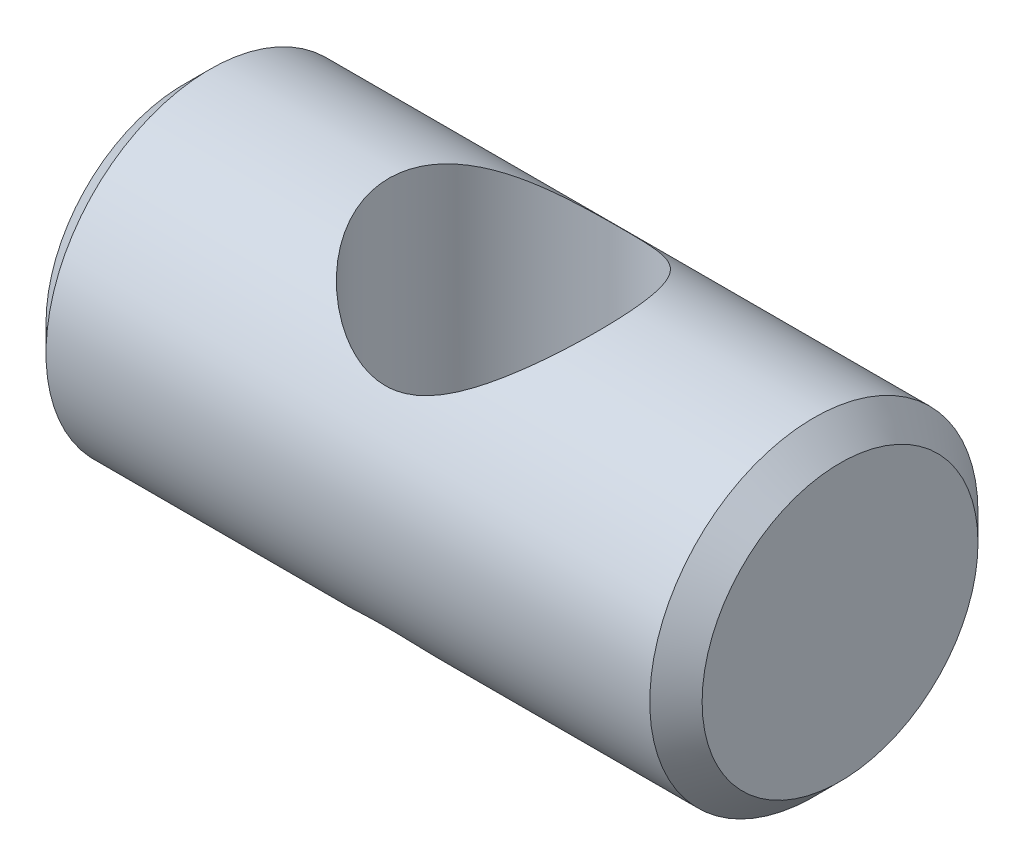
ISO-10303-21;
HEADER;
FILE_DESCRIPTION(('STEP AP214'),'2;1');
FILE_NAME('part.step','',(''),(''),'','','');
FILE_SCHEMA(('AUTOMOTIVE_DESIGN { 1 0 10303 214 1 1 1 1 }'));
ENDSEC;
DATA;
#1=APPLICATION_CONTEXT('core data for automotive mechanical design processes');
#2=APPLICATION_PROTOCOL_DEFINITION('international standard','automotive_design',2000,#1);
#3=PRODUCT_CONTEXT('',#1,'mechanical');
#4=PRODUCT('Part','Part','',(#3));
#5=PRODUCT_RELATED_PRODUCT_CATEGORY('part','',(#4));
#6=PRODUCT_DEFINITION_FORMATION('','',#4);
#7=PRODUCT_DEFINITION_CONTEXT('part definition',#1,'design');
#8=PRODUCT_DEFINITION('design','',#6,#7);
#9=PRODUCT_DEFINITION_SHAPE('','',#8);
#10=(LENGTH_UNIT() NAMED_UNIT(*) SI_UNIT(.MILLI.,.METRE.));
#11=(NAMED_UNIT(*) PLANE_ANGLE_UNIT() SI_UNIT($,.RADIAN.));
#12=(NAMED_UNIT(*) SI_UNIT($,.STERADIAN.) SOLID_ANGLE_UNIT());
#13=UNCERTAINTY_MEASURE_WITH_UNIT(LENGTH_MEASURE(1.E-05),#10,'distance_accuracy_value','');
#14=(GEOMETRIC_REPRESENTATION_CONTEXT(3) GLOBAL_UNCERTAINTY_ASSIGNED_CONTEXT((#13)) GLOBAL_UNIT_ASSIGNED_CONTEXT((#10,
#11,#12)) REPRESENTATION_CONTEXT('',''));
#15=CARTESIAN_POINT('',(0.,0.,0.));
#16=DIRECTION('',(0.,0.,1.));
#17=DIRECTION('',(1.,0.,0.));
#18=AXIS2_PLACEMENT_3D('',#15,#16,#17);
#19=CARTESIAN_POINT('',(9.525,0.,0.));
#20=DIRECTION('',(-1.,0.,0.));
#21=DIRECTION('',(0.,0.,1.));
#22=AXIS2_PLACEMENT_3D('',#19,#20,#21);
#23=CYLINDRICAL_SURFACE('',#22,4.765);
#24=CARTESIAN_POINT('',(-3.42087708051605,-4.765,0.));
#25=CARTESIAN_POINT('',(-3.42696899134863,-4.7649997101109,0.0833627581168182));
#26=CARTESIAN_POINT('',(-3.43001003086423,-4.76280757869707,0.166953392424251));
#27=CARTESIAN_POINT('',(-3.4299899120654,-4.75402028790231,0.333933182408653));
#28=CARTESIAN_POINT('',(-3.42692615604904,-4.74742325494959,0.41732223719261));
#29=CARTESIAN_POINT('',(-3.41478160746824,-4.72989865727235,0.583312250165057));
#30=CARTESIAN_POINT('',(-3.40569315136156,-4.71896558414041,0.665912068503747));
#31=CARTESIAN_POINT('',(-3.38168739143667,-4.69295834085159,0.829610597514772));
#32=CARTESIAN_POINT('',(-3.36676760565251,-4.67788240819801,0.91070865358331));
#33=CARTESIAN_POINT('',(-3.31382161536753,-4.62699847385246,1.15000632689336));
#34=CARTESIAN_POINT('',(-3.26752778272676,-4.58542013528299,1.30524951697123));
#35=CARTESIAN_POINT('',(-3.15544383432779,-4.48962808746058,1.60411463212557));
#36=CARTESIAN_POINT('',(-3.08965416222603,-4.43541466574349,1.74773682156028));
#37=CARTESIAN_POINT('',(-2.93522566350036,-4.31273538578719,2.03259497643689));
#38=CARTESIAN_POINT('',(-2.84518090003159,-4.24347672491827,2.17272279857911));
#39=CARTESIAN_POINT('',(-2.64803347355049,-4.09784606286129,2.43631552731587));
#40=CARTESIAN_POINT('',(-2.54091313456509,-4.02146672501527,2.55976291960052));
#41=CARTESIAN_POINT('',(-2.28757037498761,-3.84950291536883,2.81327393100644));
#42=CARTESIAN_POINT('',(-2.13784494064544,-3.75321839663728,2.93940806717613));
#43=CARTESIAN_POINT('',(-1.89774924473951,-3.61188607024724,3.10885207016274));
#44=CARTESIAN_POINT('',(-1.81509327318893,-3.56527135977744,3.16205944901992));
#45=CARTESIAN_POINT('',(-1.64456461914389,-3.47438917550769,3.26165283895997));
#46=CARTESIAN_POINT('',(-1.55669391813204,-3.43012082209568,3.30804141803447));
#47=CARTESIAN_POINT('',(-1.33801732923479,-3.32784018306176,3.41144333221737));
#48=CARTESIAN_POINT('',(-1.20454764001564,-3.27176419567389,3.46485738281701));
#49=CARTESIAN_POINT('',(-0.927567219273259,-3.17315327144381,3.55539465585279));
#50=CARTESIAN_POINT('',(-0.784080947165172,-3.13058666617785,3.59255605597934));
#51=CARTESIAN_POINT('',(-0.514646140223209,-3.07113542283653,3.64343651296181));
#52=CARTESIAN_POINT('',(-0.389980532152303,-3.05107413064414,3.66010628533956));
#53=CARTESIAN_POINT('',(-0.13805144197163,-3.02761567970702,3.67954153570878));
#54=CARTESIAN_POINT('',(-0.010790737951865,-3.02420155283186,3.68232117171679));
#55=CARTESIAN_POINT('',(0.242449329866106,-3.03458366659267,3.67376621747767));
#56=CARTESIAN_POINT('',(0.368429244158409,-3.04837216824954,3.66243797397314));
#57=CARTESIAN_POINT('',(0.615927376424317,-3.09094772918142,3.62657095184853));
#58=CARTESIAN_POINT('',(0.737438661719832,-3.11975712134959,3.60201250089043));
#59=CARTESIAN_POINT('',(1.02486117239319,-3.20358122773375,3.52797021750044));
#60=CARTESIAN_POINT('',(1.18741075414518,-3.26453704351351,3.47231020523667));
#61=CARTESIAN_POINT('',(1.498121783823,-3.39961296516166,3.34017866781708));
#62=CARTESIAN_POINT('',(1.64623815847782,-3.47377238661047,3.2636446149314));
#63=CARTESIAN_POINT('',(1.87825971607124,-3.60054284241464,3.12200897105521));
#64=CARTESIAN_POINT('',(1.9664324955114,-3.65156363596669,3.06234750531042));
#65=CARTESIAN_POINT('',(2.13658829521524,-3.75440484501345,2.93536296354977));
#66=CARTESIAN_POINT('',(2.21856944344932,-3.80622549668558,2.86803758566651));
#67=CARTESIAN_POINT('',(2.4548169203279,-3.96070606463684,2.65493557738645));
#68=CARTESIAN_POINT('',(2.59972905493882,-4.06258137631192,2.4978237985218));
#69=CARTESIAN_POINT('',(2.83706621766583,-4.23718725327564,2.18575837138569));
#70=CARTESIAN_POINT('',(2.93424360521689,-4.31186637762032,2.03548298499758));
#71=CARTESIAN_POINT('',(3.10568912436017,-4.44824656330391,1.71702572980925));
#72=CARTESIAN_POINT('',(3.17999040299218,-4.50996636079323,1.54887024912961));
#73=CARTESIAN_POINT('',(3.29263516387729,-4.60778480850806,1.22389848309853));
#74=CARTESIAN_POINT('',(3.33468022800881,-4.64632732736096,1.06910753325384));
#75=CARTESIAN_POINT('',(3.39687013419293,-4.70801774696666,0.752190984217971));
#76=CARTESIAN_POINT('',(3.4170259792185,-4.73117337991453,0.590069112764687));
#77=CARTESIAN_POINT('',(3.43390286080123,-4.7606051003247,0.262598143568303));
#78=CARTESIAN_POINT('',(3.43055828056669,-4.76683385814853,0.0972412962651645));
#79=CARTESIAN_POINT('',(3.40010195996678,-4.76222706928004,-0.231024129353292));
#80=CARTESIAN_POINT('',(3.37298745129903,-4.75138953488968,-0.393932420256085));
#81=CARTESIAN_POINT('',(3.29795083571309,-4.71498049061455,-0.705514268669748));
#82=CARTESIAN_POINT('',(3.25098003249397,-4.69006694126301,-0.854498752183594));
#83=CARTESIAN_POINT('',(3.13840780618742,-4.6283363468626,-1.14256413370517));
#84=CARTESIAN_POINT('',(3.07280276883643,-4.59151699239254,-1.28164310390504));
#85=CARTESIAN_POINT('',(2.91796402171938,-4.50478911028579,-1.5605913242394));
#86=CARTESIAN_POINT('',(2.82706121692328,-4.45396042558585,-1.6992420339739));
#87=CARTESIAN_POINT('',(2.62789389216064,-4.34533105232054,-1.96045324775842));
#88=CARTESIAN_POINT('',(2.51961335554432,-4.28752394420402,-2.08299871660834));
#89=CARTESIAN_POINT('',(2.26753986981794,-4.15886196775128,-2.33061071233595));
#90=CARTESIAN_POINT('',(2.12084350362776,-4.08747815085455,-2.4524560274696));
#91=CARTESIAN_POINT('',(1.80818256348861,-3.94818744226299,-2.67091966387117));
#92=CARTESIAN_POINT('',(1.64221717999394,-3.88028069682256,-2.76753692468302));
#93=CARTESIAN_POINT('',(1.32363316444147,-3.76775877390234,-2.91829752704228));
#94=CARTESIAN_POINT('',(1.17388770573105,-3.72114907301219,-2.97693831230802));
#95=CARTESIAN_POINT('',(0.94182658133829,-3.66180847873486,-3.04915600293589));
#96=CARTESIAN_POINT('',(0.863255129060431,-3.64379412637323,-3.0706008978109));
#97=CARTESIAN_POINT('',(0.703992654043785,-3.61197174564401,-3.10797188341904));
#98=CARTESIAN_POINT('',(0.62330269473567,-3.59816164910818,-3.12390068817333));
#99=CARTESIAN_POINT('',(0.459495462666014,-3.57524455910332,-3.15010468685879));
#100=CARTESIAN_POINT('',(0.376361962516611,-3.5661861203942,-3.16032158062367));
#101=CARTESIAN_POINT('',(0.209195138832908,-3.55344451616001,-3.17464168800661));
#102=CARTESIAN_POINT('',(0.125162274904953,-3.54975872585817,-3.17874788699032));
#103=CARTESIAN_POINT('',(-0.0430393452037676,-3.54795587812489,-3.18076053743013));
#104=CARTESIAN_POINT('',(-0.127208095972437,-3.54983860412504,-3.17866722999483));
#105=CARTESIAN_POINT('',(-0.29484062899608,-3.55905933774995,-3.16833758034575));
#106=CARTESIAN_POINT('',(-0.378304441298768,-3.56639711165655,-3.16010150131517));
#107=CARTESIAN_POINT('',(-0.604314657609785,-3.59341005189328,-3.129430196119));
#108=CARTESIAN_POINT('',(-0.745494317394036,-3.61818171011667,-3.10101793603989));
#109=CARTESIAN_POINT('',(-1.02069983126741,-3.67972750014127,-3.02771937958645));
#110=CARTESIAN_POINT('',(-1.1547183301723,-3.71651370639189,-2.98281650470617));
#111=CARTESIAN_POINT('',(-1.46853642894096,-3.8153502491925,-2.8560768918245));
#112=CARTESIAN_POINT('',(-1.64398166227299,-3.88152734494911,-2.76664814536404));
#113=CARTESIAN_POINT('',(-1.97551522842484,-4.02033820070584,-2.56077346334119));
#114=CARTESIAN_POINT('',(-2.13156938380249,-4.09298298410994,-2.44428083509274));
#115=CARTESIAN_POINT('',(-2.42421216807333,-4.2373970566927,-2.18450650401399));
#116=CARTESIAN_POINT('',(-2.56052605726515,-4.30914323590253,-2.04090097393914));
#117=CARTESIAN_POINT('',(-2.80802181758102,-4.44318432752427,-1.72973058522059));
#118=CARTESIAN_POINT('',(-2.91923707314103,-4.50549175797245,-1.56219804304703));
#119=CARTESIAN_POINT('',(-3.09396462152009,-4.60338031575656,-1.23969583506405));
#120=CARTESIAN_POINT('',(-3.16252149709776,-4.64178783933997,-1.08834922542924));
#121=CARTESIAN_POINT('',(-3.24875451241662,-4.68864069192958,-0.853387810710919));
#122=CARTESIAN_POINT('',(-3.27471971164357,-4.70245945854321,-0.773800863355168));
#123=CARTESIAN_POINT('',(-3.32087000112459,-4.72618391319332,-0.612411306870996));
#124=CARTESIAN_POINT('',(-3.34105760799584,-4.73609130567107,-0.530609679466056));
#125=CARTESIAN_POINT('',(-3.37353939001354,-4.75084997254152,-0.374335243630175));
#126=CARTESIAN_POINT('',(-3.38645258471521,-4.75613339853629,-0.300030947704157));
#127=CARTESIAN_POINT('',(-3.40736829831093,-4.76320900575073,-0.150546671086999));
#128=CARTESIAN_POINT('',(-3.41536951590209,-4.76500026208246,-0.075366463716097));
#129=CARTESIAN_POINT('',(-3.42087708051605,-4.765,0.));
#130=B_SPLINE_CURVE_WITH_KNOTS('',3,(#24,#25,#26,#27,#28,#29,#30,#31,#32,#33,#34,#35,#36,#37,
#38,#39,#40,#41,#42,#43,#44,#45,#46,#47,#48,#49,#50,#51,#52,#53,#54,#55,#56,#57,#58,#59,#60,#61,
#62,#63,#64,#65,#66,#67,#68,#69,#70,#71,#72,#73,#74,#75,#76,#77,#78,#79,#80,#81,#82,#83,#84,#85,
#86,#87,#88,#89,#90,#91,#92,#93,#94,#95,#96,#97,#98,#99,#100,#101,#102,#103,#104,#105,#106,#107,
#108,#109,#110,#111,#112,#113,#114,#115,#116,#117,#118,#119,#120,#121,#122,#123,#124,#125,#126,
#127,#128,#129),.UNSPECIFIED.,.T.,.F.,(4,2,2,2,2,2,2,2,2,2,2,2,2,2,2,2,2,2,2,2,2,2,2,2,2,2,2,2,
2,2,2,2,2,2,2,2,2,2,2,2,2,2,2,2,2,2,2,2,2,2,2,2,4),(0.,0.250678148817341,0.501462988541287,
0.752567445437253,1.00377889552888,1.50309474088369,2.00239922444642,2.54160992918404,
3.08138247258981,3.73300244855075,4.05909733145616,4.38506908912952,4.84654436743379,
5.30692973453839,5.68734604359481,6.06737452056514,6.44723209503533,6.82765605484285,
7.37157480546313,7.91714109472133,8.27090631470675,8.62477807035776,9.33119791439566,
9.91077027397039,10.4894988486046,10.9822712500665,11.4747958366297,11.9686961727678,
12.4626540373564,12.9352342359093,13.4079061579591,13.9261848288361,14.4449439577641,
15.0533142145202,15.6617100398796,16.1619385675779,16.4119146790501,16.6617676221917,
16.9141262556176,17.1663615593023,17.4185870532858,17.6708017414467,18.1072101440206,
18.5440584873629,19.1640002904501,19.7850197135797,20.4139885307568,21.0421157411608,
21.5513660687497,21.8056438515067,22.059810706191,22.2863833912941,22.5130160751694),.UNSPECIFIED.);
#131=CARTESIAN_POINT('',(-3.42087708051605,-4.765,0.));
#132=VERTEX_POINT('',#131);
#133=EDGE_CURVE('E10',#132,#132,#130,.T.);
#134=ORIENTED_EDGE('',*,*,#133,.T.);
#135=EDGE_LOOP('',(#134));
#136=FACE_BOUND('',#135,.T.);
#137=CARTESIAN_POINT('',(0.,3.02701585724291,3.68));
#138=CARTESIAN_POINT('',(-0.0785672773316466,3.02701614791727,3.67999984364138));
#139=CARTESIAN_POINT('',(-0.157136135576355,3.03031605642996,3.67729277636747));
#140=CARTESIAN_POINT('',(-0.313369541449519,3.04330147157753,3.66655295600809));
#141=CARTESIAN_POINT('',(-0.391034010912772,3.05298752605126,3.65851974601636));
#142=CARTESIAN_POINT('',(-0.544942339151606,3.07820352988238,3.63732812874269));
#143=CARTESIAN_POINT('',(-0.621180877977561,3.09375201630091,3.62415345944192));
#144=CARTESIAN_POINT('',(-0.771468880528867,3.12988210454059,3.59299821855179));
#145=CARTESIAN_POINT('',(-0.845516665983407,3.15046745848851,3.57501406328682));
#146=CARTESIAN_POINT('',(-1.09433047382612,3.22791462831318,3.50587087765695));
#147=CARTESIAN_POINT('',(-1.26309282362243,3.2948386580286,3.44382003292069));
#148=CARTESIAN_POINT('',(-1.50370711041474,3.40467601246938,3.33408533723919));
#149=CARTESIAN_POINT('',(-1.58189244838754,3.44290479326835,3.29468500807198));
#150=CARTESIAN_POINT('',(-1.73423285237257,3.52148653298938,3.21055545325705));
#151=CARTESIAN_POINT('',(-1.80838881793449,3.56183901380659,3.16582742418489));
#152=CARTESIAN_POINT('',(-2.02850482582811,3.68672600847628,3.02153691887044));
#153=CARTESIAN_POINT('',(-2.16807869449587,3.77315168849593,2.9137218740972));
#154=CARTESIAN_POINT('',(-2.42959010373283,3.94426933228633,2.67754924945123));
#155=CARTESIAN_POINT('',(-2.55153658554773,4.0289621561759,2.54920215427041));
#156=CARTESIAN_POINT('',(-2.77693730786715,4.1919505214112,2.27132648174838));
#157=CARTESIAN_POINT('',(-2.88023478105728,4.27018907543984,2.12163570850646));
#158=CARTESIAN_POINT('',(-3.06369900830999,4.41409842691616,1.80316374111449));
#159=CARTESIAN_POINT('',(-3.14388622560065,4.47978032533083,1.63439962117957));
#160=CARTESIAN_POINT('',(-3.26635689009236,4.58439476517905,1.30881127520956));
#161=CARTESIAN_POINT('',(-3.3126324755552,4.62591646772975,1.15433056577145));
#162=CARTESIAN_POINT('',(-3.38325654959983,4.69367027218436,0.837202280830254));
#163=CARTESIAN_POINT('',(-3.40762001451853,4.7199128126465,0.674560363681942));
#164=CARTESIAN_POINT('',(-3.43267527752513,4.75538994748078,0.345016918949486));
#165=CARTESIAN_POINT('',(-3.43328564995364,4.76456593536209,0.178102701594286));
#166=CARTESIAN_POINT('',(-3.41018166140548,4.76540378920208,-0.154080808504466));
#167=CARTESIAN_POINT('',(-3.38646547727926,4.75706434242047,-0.319349977022772));
#168=CARTESIAN_POINT('',(-3.31775156953333,4.72510260499364,-0.634317782486346));
#169=CARTESIAN_POINT('',(-3.27397352746067,4.70233080305011,-0.784375176401478));
#170=CARTESIAN_POINT('',(-3.16750864597913,4.64450941494238,-1.07505429218324));
#171=CARTESIAN_POINT('',(-3.10481828431147,4.60945754152293,-1.21567425043883));
#172=CARTESIAN_POINT('',(-2.95652856255593,4.52638674091888,-1.49677788855974));
#173=CARTESIAN_POINT('',(-2.86942133720827,4.47751111873768,-1.63620711351601));
#174=CARTESIAN_POINT('',(-2.67788120319372,4.37232420780869,-1.89951272145431));
#175=CARTESIAN_POINT('',(-2.57343424063936,4.31600689517522,-2.02337634423388));
#176=CARTESIAN_POINT('',(-2.32992989714121,4.18996971318213,-2.27426780979749));
#177=CARTESIAN_POINT('',(-2.18800876851398,4.11960732735628,-2.39819784816123));
#178=CARTESIAN_POINT('',(-1.88505782163776,3.98107848473248,-2.62174133186739));
#179=CARTESIAN_POINT('',(-1.72402241690679,3.91291267736107,-2.72134764203992));
#180=CARTESIAN_POINT('',(-1.40961518716303,3.79636450990898,-2.881168849186));
#181=CARTESIAN_POINT('',(-1.25863725138286,3.74654731116981,-2.94503209171547));
#182=CARTESIAN_POINT('',(-0.945527440392476,3.66060402226399,-3.05121747931762));
#183=CARTESIAN_POINT('',(-0.783414037013453,3.62445587601066,-3.09357436476774));
#184=CARTESIAN_POINT('',(-0.533813056438613,3.58476149841442,-3.13928376884266));
#185=CARTESIAN_POINT('',(-0.449028547115524,3.57393161480045,-3.15156761613341));
#186=CARTESIAN_POINT('',(-0.278275024285711,3.55780077117141,-3.16976872881678));
#187=CARTESIAN_POINT('',(-0.192306660171834,3.5524968934398,-3.17568935402606));
#188=CARTESIAN_POINT('',(-0.020032770904315,3.54772147962291,-3.18102355866001));
#189=CARTESIAN_POINT('',(0.0662726316081444,3.54824798964232,-3.18043931801256));
#190=CARTESIAN_POINT('',(0.238338872801625,3.55508375410915,-3.17279435887041));
#191=CARTESIAN_POINT('',(0.324099748085624,3.56139261563451,-3.16573408043507));
#192=CARTESIAN_POINT('',(0.553401842306173,3.58576306843395,-3.13816835119393));
#193=CARTESIAN_POINT('',(0.69573919740344,3.60894237647337,-3.11173256017326));
#194=CARTESIAN_POINT('',(0.973480788870408,3.6678298405413,-3.04208625520151));
#195=CARTESIAN_POINT('',(1.10887734054378,3.70355155394913,-2.99885758403296));
#196=CARTESIAN_POINT('',(1.42379146726814,3.7997001514418,-2.87675019956371));
#197=CARTESIAN_POINT('',(1.59919673865542,3.86428769996493,-2.79052654374781));
#198=CARTESIAN_POINT('',(1.93113815119942,4.00059813210694,-2.59133845951309));
#199=CARTESIAN_POINT('',(2.08764088718698,4.07233325050109,-2.47832770642991));
#200=CARTESIAN_POINT('',(2.38199709911893,4.21579037939226,-2.22570370446708));
#201=CARTESIAN_POINT('',(2.51955338419097,4.28749766673045,-2.08573466326166));
#202=CARTESIAN_POINT('',(2.77028243502779,4.42234806198233,-1.78201502187867));
#203=CARTESIAN_POINT('',(2.88349257282064,4.48550424008068,-1.61830152645774));
#204=CARTESIAN_POINT('',(3.06402610957439,4.58658548395503,-1.30045140866569));
#205=CARTESIAN_POINT('',(3.13591982023922,4.62699541781642,-1.1497087789086));
#206=CARTESIAN_POINT('',(3.25766051296821,4.69370617156705,-0.836599849304389));
#207=CARTESIAN_POINT('',(3.30752205037566,4.7200163088041,-0.674241306034806));
#208=CARTESIAN_POINT('',(3.3829870904449,4.75572615385405,-0.341241432427482));
#209=CARTESIAN_POINT('',(3.40846923089666,4.7650414665297,-0.170563063438744));
#210=CARTESIAN_POINT('',(3.4334390909829,4.76495829995348,0.172677006169809));
#211=CARTESIAN_POINT('',(3.43293306367628,4.7555643228997,0.345238243758836));
#212=CARTESIAN_POINT('',(3.40754400048731,4.71998636563285,0.67212649572784));
#213=CARTESIAN_POINT('',(3.38468468821344,4.69525837988108,0.826779473459491));
#214=CARTESIAN_POINT('',(3.31910619707247,4.63193340521078,1.12882616508402));
#215=CARTESIAN_POINT('',(3.27638180384756,4.59333277548538,1.27621796175838));
#216=CARTESIAN_POINT('',(3.17042951924722,4.50215126554465,1.5686260572414));
#217=CARTESIAN_POINT('',(3.10621371599284,4.44892473542071,1.71307815224114));
#218=CARTESIAN_POINT('',(2.96073945861412,4.33272638873523,1.98874620073681));
#219=CARTESIAN_POINT('',(2.87947919610232,4.26975353829207,2.11996074756245));
#220=CARTESIAN_POINT('',(2.68651050838254,4.12556821291774,2.39003735747662));
#221=CARTESIAN_POINT('',(2.57196063848181,4.04309554925752,2.52618739114483));
#222=CARTESIAN_POINT('',(2.32447412944916,3.87408431941462,2.77844859407009));
#223=CARTESIAN_POINT('',(2.19149095139184,3.78753584009048,2.89450731580785));
#224=CARTESIAN_POINT('',(1.96595276183287,3.65130486353125,3.06263487303052));
#225=CARTESIAN_POINT('',(1.87886470860019,3.60090149373494,3.12157066922301));
#226=CARTESIAN_POINT('',(1.69862262017005,3.50236607543005,3.23173475735497));
#227=CARTESIAN_POINT('',(1.60546616441238,3.45423494663789,3.28295994638551));
#228=CARTESIAN_POINT('',(1.41335402823623,3.36225362869259,3.37709887635029));
#229=CARTESIAN_POINT('',(1.31441341048654,3.31839304937429,3.4200330530899));
#230=CARTESIAN_POINT('',(1.11061583662532,3.23713845030014,3.49704051581634));
#231=CARTESIAN_POINT('',(1.00576424358736,3.19973868995705,3.53112168161428));
#232=CARTESIAN_POINT('',(0.826860618617418,3.1451674862639,3.57966454279998));
#233=CARTESIAN_POINT('',(0.754330914941613,3.12542579098052,3.59686794878708));
#234=CARTESIAN_POINT('',(0.607204587985835,3.09080711138969,3.62665947956898));
#235=CARTESIAN_POINT('',(0.532609008476296,3.07592771737776,3.63924989089071));
#236=CARTESIAN_POINT('',(0.38209665983941,3.05181598122002,3.65949364139542));
#237=CARTESIAN_POINT('',(0.306185151895193,3.04256489437812,3.66716337327478));
#238=CARTESIAN_POINT('',(0.153516252829605,3.03016475948479,3.67741657137031));
#239=CARTESIAN_POINT('',(0.0767588809019638,3.02701557325904,3.68000015275969));
#240=CARTESIAN_POINT('',(0.,3.02701585724291,3.68));
#241=B_SPLINE_CURVE_WITH_KNOTS('',3,(#137,#138,#139,#140,#141,#142,#143,#144,#145,#146,#147,
#148,#149,#150,#151,#152,#153,#154,#155,#156,#157,#158,#159,#160,#161,#162,#163,#164,#165,#166,
#167,#168,#169,#170,#171,#172,#173,#174,#175,#176,#177,#178,#179,#180,#181,#182,#183,#184,#185,
#186,#187,#188,#189,#190,#191,#192,#193,#194,#195,#196,#197,#198,#199,#200,#201,#202,#203,#204,
#205,#206,#207,#208,#209,#210,#211,#212,#213,#214,#215,#216,#217,#218,#219,#220,#221,#222,#223,
#224,#225,#226,#227,#228,#229,#230,#231,#232,#233,#234,#235,#236,#237,#238,#239,#240),
.UNSPECIFIED.,.T.,.F.,(4,2,2,2,2,2,2,2,2,2,2,2,2,2,2,2,2,2,2,2,2,2,2,2,2,2,2,2,2,2,2,2,2,2,2,2,
2,2,2,2,2,2,2,2,2,2,2,2,2,2,2,4),(0.,0.235591708988226,0.471203630963838,0.707566894291256,
0.944106771258296,1.51591397043087,1.80236618274396,2.08875418016066,2.67592975620556,
3.26280644257576,3.85440755326201,4.44548320346413,4.94292664174491,5.44002983205938,
5.93883694376225,6.43768144120931,6.9095606777859,7.38152785217115,7.89413675044232,
8.40716316586385,9.00813916387887,9.60929124216605,10.1214610992978,10.6328009675269,
10.8914987801306,11.1500599316432,11.4085344360666,11.6669913779457,12.1048085655683,
12.5431004643861,13.1573710774192,13.7727118402267,14.3968121302921,15.0199474601663,
15.5333029695888,16.0463188267164,16.5618754223646,17.077307969612,17.550023970907,
18.0228641248864,18.5213957266873,19.0199802486027,19.6062313855034,20.1939905554461,
20.5434646283834,20.8930789631276,21.2418202453876,21.5902500511245,21.8213124314337,
22.0522601254179,22.2824343920731,22.5126034464923),.UNSPECIFIED.);
#242=CARTESIAN_POINT('',(0.,3.02701585724291,3.68));
#243=VERTEX_POINT('',#242);
#244=EDGE_CURVE('E46',#243,#243,#241,.T.);
#245=ORIENTED_EDGE('',*,*,#244,.T.);
#246=EDGE_LOOP('',(#245));
#247=FACE_BOUND('',#246,.T.);
#248=CARTESIAN_POINT('',(8.76500000000001,0.,0.));
#249=DIRECTION('',(1.,0.,0.));
#250=DIRECTION('',(0.,0.,-1.));
#251=AXIS2_PLACEMENT_3D('',#248,#249,#250);
#252=CIRCLE('',#251,4.765);
#253=CARTESIAN_POINT('',(8.76500000000001,0.,-4.765));
#254=VERTEX_POINT('',#253);
#255=EDGE_CURVE('E54',#254,#254,#252,.F.);
#256=ORIENTED_EDGE('',*,*,#255,.T.);
#257=EDGE_LOOP('',(#256));
#258=FACE_BOUND('',#257,.T.);
#259=CARTESIAN_POINT('',(-8.76499999999999,0.,0.));
#260=DIRECTION('',(1.,0.,0.));
#261=DIRECTION('',(0.,0.,-1.));
#262=AXIS2_PLACEMENT_3D('',#259,#260,#261);
#263=CIRCLE('',#262,4.765);
#264=CARTESIAN_POINT('',(-8.76499999999999,0.,-4.765));
#265=VERTEX_POINT('',#264);
#266=EDGE_CURVE('E88',#265,#265,#263,.T.);
#267=ORIENTED_EDGE('',*,*,#266,.T.);
#268=EDGE_LOOP('',(#267));
#269=FACE_BOUND('',#268,.T.);
#270=ADVANCED_FACE('F33',(#136,#247,#258,#269),#23,.T.);
#271=CARTESIAN_POINT('',(9.525,0.,0.));
#272=DIRECTION('',(1.,0.,0.));
#273=DIRECTION('',(0.,0.,-1.));
#274=AXIS2_PLACEMENT_3D('',#271,#272,#273);
#275=PLANE('',#274);
#276=CARTESIAN_POINT('',(9.525,0.,0.));
#277=DIRECTION('',(1.,0.,0.));
#278=DIRECTION('',(0.,0.,-1.));
#279=AXIS2_PLACEMENT_3D('',#276,#277,#278);
#280=CIRCLE('',#279,4.00500000000001);
#281=CARTESIAN_POINT('',(9.525,0.,-4.00500000000001));
#282=VERTEX_POINT('',#281);
#283=EDGE_CURVE('E90',#282,#282,#280,.T.);
#284=ORIENTED_EDGE('',*,*,#283,.T.);
#285=EDGE_LOOP('',(#284));
#286=FACE_BOUND('',#285,.T.);
#287=ADVANCED_FACE('F67',(#286),#275,.T.);
#288=CARTESIAN_POINT('',(-9.525,0.,0.));
#289=DIRECTION('',(1.,0.,0.));
#290=DIRECTION('',(0.,0.,-1.));
#291=AXIS2_PLACEMENT_3D('',#288,#289,#290);
#292=PLANE('',#291);
#293=CARTESIAN_POINT('',(-9.525,0.,0.));
#294=DIRECTION('',(1.,0.,0.));
#295=DIRECTION('',(0.,0.,-1.));
#296=AXIS2_PLACEMENT_3D('',#293,#294,#295);
#297=CIRCLE('',#296,4.00499999999998);
#298=CARTESIAN_POINT('',(-9.525,0.,-4.00499999999998));
#299=VERTEX_POINT('',#298);
#300=EDGE_CURVE('E50',#299,#299,#297,.F.);
#301=ORIENTED_EDGE('',*,*,#300,.T.);
#302=EDGE_LOOP('',(#301));
#303=FACE_BOUND('',#302,.T.);
#304=ADVANCED_FACE('F70',(#303),#292,.F.);
#305=CARTESIAN_POINT('',(9.525,0.,0.));
#306=DIRECTION('',(-1.,0.,0.));
#307=DIRECTION('',(0.,0.,1.));
#308=AXIS2_PLACEMENT_3D('',#305,#306,#307);
#309=CONICAL_SURFACE('',#308,4.00500000000001,0.785398163397448);
#310=ORIENTED_EDGE('',*,*,#255,.F.);
#311=EDGE_LOOP('',(#310));
#312=FACE_BOUND('',#311,.T.);
#313=ORIENTED_EDGE('',*,*,#283,.F.);
#314=EDGE_LOOP('',(#313));
#315=FACE_BOUND('',#314,.T.);
#316=ADVANCED_FACE('F73',(#312,#315),#309,.T.);
#317=CARTESIAN_POINT('',(-8.76499999999999,0.,0.));
#318=DIRECTION('',(1.,0.,0.));
#319=DIRECTION('',(0.,0.,-1.));
#320=AXIS2_PLACEMENT_3D('',#317,#318,#319);
#321=CONICAL_SURFACE('',#320,4.765,0.785398163397451);
#322=ORIENTED_EDGE('',*,*,#300,.F.);
#323=EDGE_LOOP('',(#322));
#324=FACE_BOUND('',#323,.T.);
#325=ORIENTED_EDGE('',*,*,#266,.F.);
#326=EDGE_LOOP('',(#325));
#327=FACE_BOUND('',#326,.T.);
#328=ADVANCED_FACE('F36',(#324,#327),#321,.T.);
#329=CARTESIAN_POINT('',(0.,-4.765,0.25));
#330=DIRECTION('',(0.,1.,0.));
#331=DIRECTION('',(0.,0.,1.));
#332=AXIS2_PLACEMENT_3D('',#329,#330,#331);
#333=CYLINDRICAL_SURFACE('',#332,3.43);
#334=ORIENTED_EDGE('',*,*,#244,.F.);
#335=EDGE_LOOP('',(#334));
#336=FACE_BOUND('',#335,.T.);
#337=ORIENTED_EDGE('',*,*,#133,.F.);
#338=EDGE_LOOP('',(#337));
#339=FACE_BOUND('',#338,.T.);
#340=ADVANCED_FACE('F62',(#336,#339),#333,.F.);
#341=CLOSED_SHELL('',(#270,#287,#304,#316,#328,#340));
#342=MANIFOLD_SOLID_BREP('B2',#341);
#343=ADVANCED_BREP_SHAPE_REPRESENTATION('',(#18,#342),#14);
#344=SHAPE_DEFINITION_REPRESENTATION(#9,#343);
ENDSEC;
END-ISO-10303-21;
